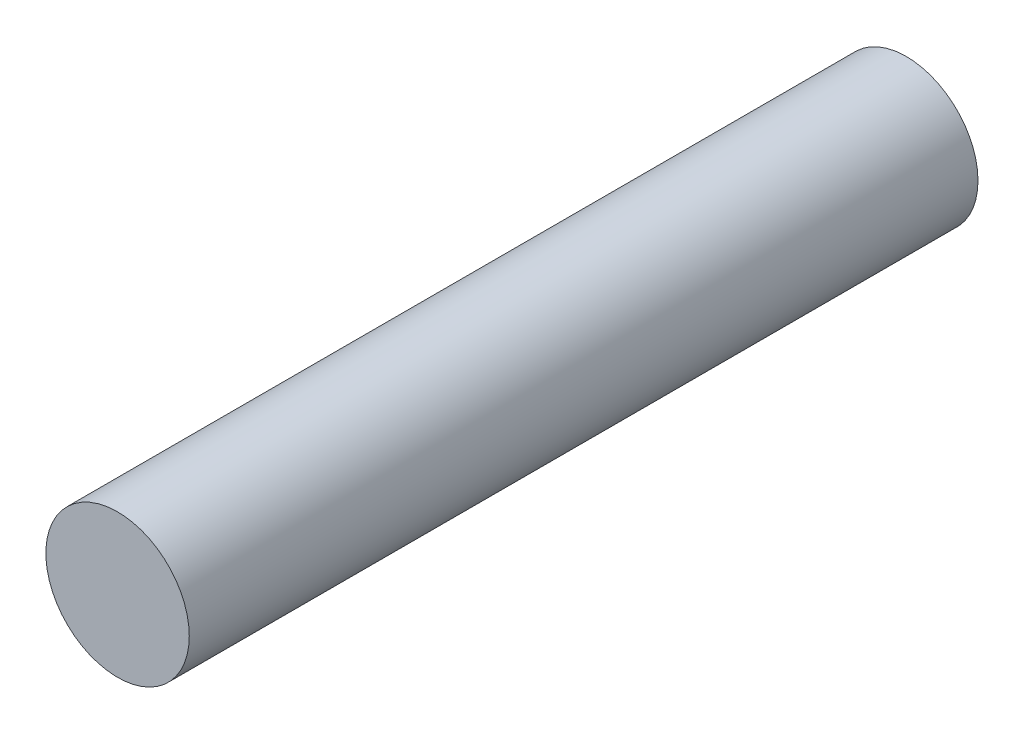
ISO-10303-21;
HEADER;
FILE_DESCRIPTION(('STEP AP214'),'2;1');
FILE_NAME('part.step','',(''),(''),'','','');
FILE_SCHEMA(('AUTOMOTIVE_DESIGN { 1 0 10303 214 1 1 1 1 }'));
ENDSEC;
DATA;
#1=APPLICATION_CONTEXT('core data for automotive mechanical design processes');
#2=APPLICATION_PROTOCOL_DEFINITION('international standard','automotive_design',2000,#1);
#3=PRODUCT_CONTEXT('',#1,'mechanical');
#4=PRODUCT('Part','Part','',(#3));
#5=PRODUCT_RELATED_PRODUCT_CATEGORY('part','',(#4));
#6=PRODUCT_DEFINITION_FORMATION('','',#4);
#7=PRODUCT_DEFINITION_CONTEXT('part definition',#1,'design');
#8=PRODUCT_DEFINITION('design','',#6,#7);
#9=PRODUCT_DEFINITION_SHAPE('','',#8);
#10=(LENGTH_UNIT() NAMED_UNIT(*) SI_UNIT(.MILLI.,.METRE.));
#11=(NAMED_UNIT(*) PLANE_ANGLE_UNIT() SI_UNIT($,.RADIAN.));
#12=(NAMED_UNIT(*) SI_UNIT($,.STERADIAN.) SOLID_ANGLE_UNIT());
#13=UNCERTAINTY_MEASURE_WITH_UNIT(LENGTH_MEASURE(1.E-05),#10,'distance_accuracy_value','');
#14=(GEOMETRIC_REPRESENTATION_CONTEXT(3) GLOBAL_UNCERTAINTY_ASSIGNED_CONTEXT((#13)) GLOBAL_UNIT_ASSIGNED_CONTEXT((#10,
#11,#12)) REPRESENTATION_CONTEXT('',''));
#15=CARTESIAN_POINT('',(0.,0.,0.));
#16=DIRECTION('',(0.,0.,1.));
#17=DIRECTION('',(1.,0.,0.));
#18=AXIS2_PLACEMENT_3D('',#15,#16,#17);
#19=CARTESIAN_POINT('',(0.,0.,22.));
#20=DIRECTION('',(0.,0.,-1.));
#21=DIRECTION('',(-1.,0.,0.));
#22=AXIS2_PLACEMENT_3D('',#19,#20,#21);
#23=CYLINDRICAL_SURFACE('',#22,2.);
#24=CARTESIAN_POINT('',(0.,0.,22.));
#25=DIRECTION('',(0.,0.,1.));
#26=DIRECTION('',(1.,0.,0.));
#27=AXIS2_PLACEMENT_3D('',#24,#25,#26);
#28=CIRCLE('',#27,2.);
#29=CARTESIAN_POINT('',(2.,0.,22.));
#30=VERTEX_POINT('',#29);
#31=EDGE_CURVE('E10',#30,#30,#28,.T.);
#32=ORIENTED_EDGE('',*,*,#31,.F.);
#33=EDGE_LOOP('',(#32));
#34=FACE_BOUND('',#33,.T.);
#35=CARTESIAN_POINT('',(0.,0.,0.));
#36=DIRECTION('',(0.,0.,1.));
#37=DIRECTION('',(1.,0.,0.));
#38=AXIS2_PLACEMENT_3D('',#35,#36,#37);
#39=CIRCLE('',#38,2.);
#40=CARTESIAN_POINT('',(2.,0.,0.));
#41=VERTEX_POINT('',#40);
#42=EDGE_CURVE('E35',#41,#41,#39,.T.);
#43=ORIENTED_EDGE('',*,*,#42,.T.);
#44=EDGE_LOOP('',(#43));
#45=FACE_BOUND('',#44,.T.);
#46=ADVANCED_FACE('F32',(#34,#45),#23,.T.);
#47=CARTESIAN_POINT('',(0.,0.,22.));
#48=DIRECTION('',(0.,0.,1.));
#49=DIRECTION('',(1.,0.,0.));
#50=AXIS2_PLACEMENT_3D('',#47,#48,#49);
#51=PLANE('',#50);
#52=ORIENTED_EDGE('',*,*,#31,.T.);
#53=EDGE_LOOP('',(#52));
#54=FACE_BOUND('',#53,.T.);
#55=ADVANCED_FACE('F47',(#54),#51,.T.);
#56=CARTESIAN_POINT('',(0.,0.,0.));
#57=DIRECTION('',(0.,0.,1.));
#58=DIRECTION('',(1.,0.,0.));
#59=AXIS2_PLACEMENT_3D('',#56,#57,#58);
#60=PLANE('',#59);
#61=ORIENTED_EDGE('',*,*,#42,.F.);
#62=EDGE_LOOP('',(#61));
#63=FACE_BOUND('',#62,.T.);
#64=ADVANCED_FACE('F45',(#63),#60,.F.);
#65=CLOSED_SHELL('',(#46,#55,#64));
#66=MANIFOLD_SOLID_BREP('B2',#65);
#67=ADVANCED_BREP_SHAPE_REPRESENTATION('',(#18,#66),#14);
#68=SHAPE_DEFINITION_REPRESENTATION(#9,#67);
ENDSEC;
END-ISO-10303-21;
